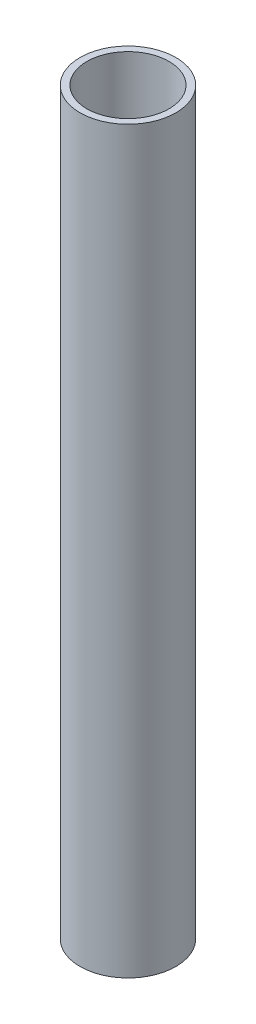
ISO-10303-21;
HEADER;
FILE_DESCRIPTION(('STEP AP214'),'2;1');
FILE_NAME('part.step','',(''),(''),'','','');
FILE_SCHEMA(('AUTOMOTIVE_DESIGN { 1 0 10303 214 1 1 1 1 }'));
ENDSEC;
DATA;
#1=APPLICATION_CONTEXT('core data for automotive mechanical design processes');
#2=APPLICATION_PROTOCOL_DEFINITION('international standard','automotive_design',2000,#1);
#3=PRODUCT_CONTEXT('',#1,'mechanical');
#4=PRODUCT('Part','Part','',(#3));
#5=PRODUCT_RELATED_PRODUCT_CATEGORY('part','',(#4));
#6=PRODUCT_DEFINITION_FORMATION('','',#4);
#7=PRODUCT_DEFINITION_CONTEXT('part definition',#1,'design');
#8=PRODUCT_DEFINITION('design','',#6,#7);
#9=PRODUCT_DEFINITION_SHAPE('','',#8);
#10=(LENGTH_UNIT() NAMED_UNIT(*) SI_UNIT(.MILLI.,.METRE.));
#11=(NAMED_UNIT(*) PLANE_ANGLE_UNIT() SI_UNIT($,.RADIAN.));
#12=(NAMED_UNIT(*) SI_UNIT($,.STERADIAN.) SOLID_ANGLE_UNIT());
#13=UNCERTAINTY_MEASURE_WITH_UNIT(LENGTH_MEASURE(1.E-05),#10,'distance_accuracy_value','');
#14=(GEOMETRIC_REPRESENTATION_CONTEXT(3) GLOBAL_UNCERTAINTY_ASSIGNED_CONTEXT((#13)) GLOBAL_UNIT_ASSIGNED_CONTEXT((#10,
#11,#12)) REPRESENTATION_CONTEXT('',''));
#15=CARTESIAN_POINT('',(0.,0.,0.));
#16=DIRECTION('',(0.,0.,1.));
#17=DIRECTION('',(1.,0.,0.));
#18=AXIS2_PLACEMENT_3D('',#15,#16,#17);
#19=CARTESIAN_POINT('',(0.,54.,0.));
#20=DIRECTION('',(0.,1.,0.));
#21=DIRECTION('',(0.,0.,1.));
#22=AXIS2_PLACEMENT_3D('',#19,#20,#21);
#23=PLANE('',#22);
#24=CARTESIAN_POINT('',(0.,54.,0.));
#25=DIRECTION('',(0.,1.,0.));
#26=DIRECTION('',(0.,0.,1.));
#27=AXIS2_PLACEMENT_3D('',#24,#25,#26);
#28=CIRCLE('',#27,3.5);
#29=CARTESIAN_POINT('',(0.,54.,3.5));
#30=VERTEX_POINT('',#29);
#31=EDGE_CURVE('E10',#30,#30,#28,.T.);
#32=ORIENTED_EDGE('',*,*,#31,.T.);
#33=EDGE_LOOP('',(#32));
#34=FACE_BOUND('',#33,.T.);
#35=CARTESIAN_POINT('',(0.,54.,0.));
#36=DIRECTION('',(0.,1.,0.));
#37=DIRECTION('',(0.,0.,1.));
#38=AXIS2_PLACEMENT_3D('',#35,#36,#37);
#39=CIRCLE('',#38,3.);
#40=CARTESIAN_POINT('',(0.,54.,3.));
#41=VERTEX_POINT('',#40);
#42=EDGE_CURVE('E60',#41,#41,#39,.T.);
#43=ORIENTED_EDGE('',*,*,#42,.F.);
#44=EDGE_LOOP('',(#43));
#45=FACE_BOUND('',#44,.T.);
#46=ADVANCED_FACE('F47',(#34,#45),#23,.T.);
#47=CARTESIAN_POINT('',(0.,0.,0.));
#48=DIRECTION('',(0.,1.,0.));
#49=DIRECTION('',(0.,0.,1.));
#50=AXIS2_PLACEMENT_3D('',#47,#48,#49);
#51=PLANE('',#50);
#52=CARTESIAN_POINT('',(0.,0.,0.));
#53=DIRECTION('',(0.,1.,0.));
#54=DIRECTION('',(0.,0.,1.));
#55=AXIS2_PLACEMENT_3D('',#52,#53,#54);
#56=CIRCLE('',#55,3.5);
#57=CARTESIAN_POINT('',(0.,0.,3.5));
#58=VERTEX_POINT('',#57);
#59=EDGE_CURVE('E51',#58,#58,#56,.T.);
#60=ORIENTED_EDGE('',*,*,#59,.F.);
#61=EDGE_LOOP('',(#60));
#62=FACE_BOUND('',#61,.T.);
#63=CARTESIAN_POINT('',(0.,0.,0.));
#64=DIRECTION('',(0.,1.,0.));
#65=DIRECTION('',(0.,0.,1.));
#66=AXIS2_PLACEMENT_3D('',#63,#64,#65);
#67=CIRCLE('',#66,3.);
#68=CARTESIAN_POINT('',(0.,0.,3.));
#69=VERTEX_POINT('',#68);
#70=EDGE_CURVE('E62',#69,#69,#67,.T.);
#71=ORIENTED_EDGE('',*,*,#70,.T.);
#72=EDGE_LOOP('',(#71));
#73=FACE_BOUND('',#72,.T.);
#74=ADVANCED_FACE('F74',(#62,#73),#51,.F.);
#75=CARTESIAN_POINT('',(0.,54.,0.));
#76=DIRECTION('',(0.,-1.,0.));
#77=DIRECTION('',(0.,0.,-1.));
#78=AXIS2_PLACEMENT_3D('',#75,#76,#77);
#79=CYLINDRICAL_SURFACE('',#78,3.5);
#80=ORIENTED_EDGE('',*,*,#31,.F.);
#81=EDGE_LOOP('',(#80));
#82=FACE_BOUND('',#81,.T.);
#83=ORIENTED_EDGE('',*,*,#59,.T.);
#84=EDGE_LOOP('',(#83));
#85=FACE_BOUND('',#84,.T.);
#86=ADVANCED_FACE('F49',(#82,#85),#79,.T.);
#87=CARTESIAN_POINT('',(0.,54.,0.));
#88=DIRECTION('',(0.,-1.,0.));
#89=DIRECTION('',(0.,0.,-1.));
#90=AXIS2_PLACEMENT_3D('',#87,#88,#89);
#91=CYLINDRICAL_SURFACE('',#90,3.);
#92=ORIENTED_EDGE('',*,*,#42,.T.);
#93=EDGE_LOOP('',(#92));
#94=FACE_BOUND('',#93,.T.);
#95=ORIENTED_EDGE('',*,*,#70,.F.);
#96=EDGE_LOOP('',(#95));
#97=FACE_BOUND('',#96,.T.);
#98=ADVANCED_FACE('F70',(#94,#97),#91,.F.);
#99=CLOSED_SHELL('',(#46,#74,#86,#98));
#100=MANIFOLD_SOLID_BREP('B2',#99);
#101=ADVANCED_BREP_SHAPE_REPRESENTATION('',(#18,#100),#14);
#102=SHAPE_DEFINITION_REPRESENTATION(#9,#101);
ENDSEC;
END-ISO-10303-21;
